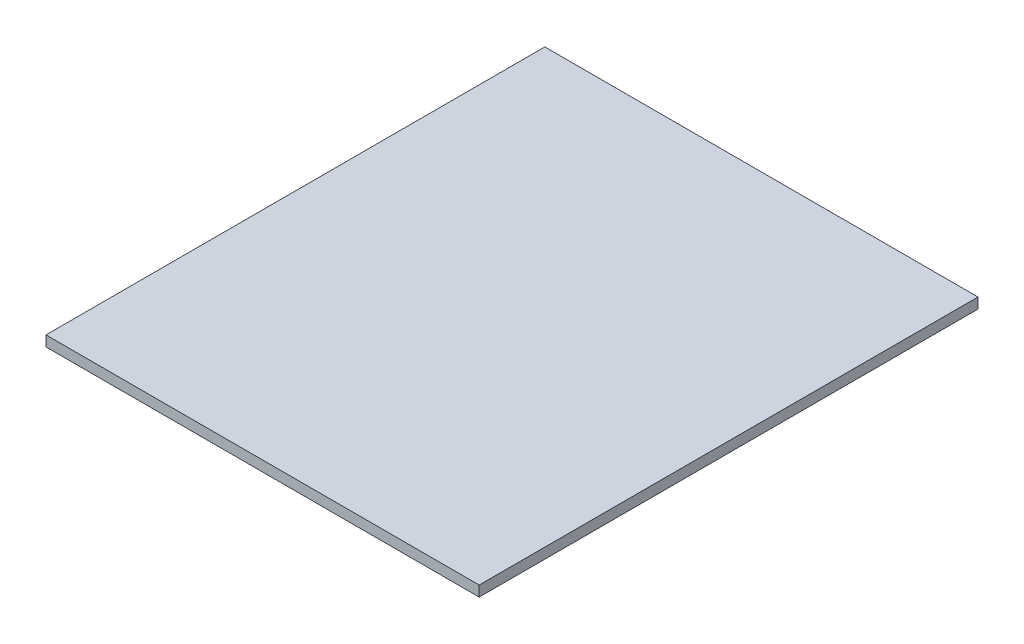
ISO-10303-21;
HEADER;
FILE_DESCRIPTION(('STEP AP214'),'2;1');
FILE_NAME('part.step','',(''),(''),'','','');
FILE_SCHEMA(('AUTOMOTIVE_DESIGN { 1 0 10303 214 1 1 1 1 }'));
ENDSEC;
DATA;
#1=APPLICATION_CONTEXT('core data for automotive mechanical design processes');
#2=APPLICATION_PROTOCOL_DEFINITION('international standard','automotive_design',2000,#1);
#3=PRODUCT_CONTEXT('',#1,'mechanical');
#4=PRODUCT('Part','Part','',(#3));
#5=PRODUCT_RELATED_PRODUCT_CATEGORY('part','',(#4));
#6=PRODUCT_DEFINITION_FORMATION('','',#4);
#7=PRODUCT_DEFINITION_CONTEXT('part definition',#1,'design');
#8=PRODUCT_DEFINITION('design','',#6,#7);
#9=PRODUCT_DEFINITION_SHAPE('','',#8);
#10=(LENGTH_UNIT() NAMED_UNIT(*) SI_UNIT(.MILLI.,.METRE.));
#11=(NAMED_UNIT(*) PLANE_ANGLE_UNIT() SI_UNIT($,.RADIAN.));
#12=(NAMED_UNIT(*) SI_UNIT($,.STERADIAN.) SOLID_ANGLE_UNIT());
#13=UNCERTAINTY_MEASURE_WITH_UNIT(LENGTH_MEASURE(1.E-05),#10,'distance_accuracy_value','');
#14=(GEOMETRIC_REPRESENTATION_CONTEXT(3) GLOBAL_UNCERTAINTY_ASSIGNED_CONTEXT((#13)) GLOBAL_UNIT_ASSIGNED_CONTEXT((#10,
#11,#12)) REPRESENTATION_CONTEXT('',''));
#15=CARTESIAN_POINT('',(0.,0.,0.));
#16=DIRECTION('',(0.,0.,1.));
#17=DIRECTION('',(1.,0.,0.));
#18=AXIS2_PLACEMENT_3D('',#15,#16,#17);
#19=CARTESIAN_POINT('',(-859.675895884739,40.48125,965.077977864291));
#20=DIRECTION('',(1.,0.,0.));
#21=DIRECTION('',(0.,0.,-1.));
#22=AXIS2_PLACEMENT_3D('',#19,#20,#21);
#23=PLANE('',#22);
#24=DIRECTION('',(0.,0.,1.));
#25=VECTOR('',#24,1.);
#26=CARTESIAN_POINT('',(-859.675895884739,0.,965.077977864291));
#27=LINE('',#26,#25);
#28=CARTESIAN_POINT('',(-859.675895884739,0.,-965.322022135709));
#29=VERTEX_POINT('',#28);
#30=CARTESIAN_POINT('',(-859.675895884739,0.,965.077977864291));
#31=VERTEX_POINT('',#30);
#32=EDGE_CURVE('E99',#29,#31,#27,.T.);
#33=ORIENTED_EDGE('',*,*,#32,.T.);
#34=DIRECTION('',(0.,-1.,0.));
#35=VECTOR('',#34,1.);
#36=CARTESIAN_POINT('',(-859.675895884739,40.48125,965.077977864291));
#37=LINE('',#36,#35);
#38=CARTESIAN_POINT('',(-859.675895884739,40.48125,965.077977864291));
#39=VERTEX_POINT('',#38);
#40=EDGE_CURVE('E11',#39,#31,#37,.T.);
#41=ORIENTED_EDGE('',*,*,#40,.F.);
#42=DIRECTION('',(0.,0.,1.));
#43=VECTOR('',#42,1.);
#44=CARTESIAN_POINT('',(-859.675895884739,40.48125,965.077977864291));
#45=LINE('',#44,#43);
#46=CARTESIAN_POINT('',(-859.675895884739,40.48125,-965.322022135709));
#47=VERTEX_POINT('',#46);
#48=EDGE_CURVE('E87',#47,#39,#45,.T.);
#49=ORIENTED_EDGE('',*,*,#48,.F.);
#50=DIRECTION('',(0.,-1.,0.));
#51=VECTOR('',#50,1.);
#52=CARTESIAN_POINT('',(-859.675895884739,40.48125,-965.322022135709));
#53=LINE('',#52,#51);
#54=EDGE_CURVE('E95',#47,#29,#53,.T.);
#55=ORIENTED_EDGE('',*,*,#54,.T.);
#56=EDGE_LOOP('',(#33,#41,#49,#55));
#57=FACE_BOUND('',#56,.T.);
#58=ADVANCED_FACE('F36',(#57),#23,.F.);
#59=CARTESIAN_POINT('',(-859.675895884739,40.48125,965.077977864291));
#60=DIRECTION('',(0.,0.,-1.));
#61=DIRECTION('',(-1.,0.,0.));
#62=AXIS2_PLACEMENT_3D('',#59,#60,#61);
#63=PLANE('',#62);
#64=DIRECTION('',(1.,0.,0.));
#65=VECTOR('',#64,1.);
#66=CARTESIAN_POINT('',(-859.675895884739,0.,965.077977864291));
#67=LINE('',#66,#65);
#68=CARTESIAN_POINT('',(816.72410411526,0.,965.077977864291));
#69=VERTEX_POINT('',#68);
#70=EDGE_CURVE('E91',#31,#69,#67,.T.);
#71=ORIENTED_EDGE('',*,*,#70,.T.);
#72=DIRECTION('',(0.,-1.,0.));
#73=VECTOR('',#72,1.);
#74=CARTESIAN_POINT('',(816.72410411526,40.48125,965.077977864291));
#75=LINE('',#74,#73);
#76=CARTESIAN_POINT('',(816.72410411526,40.48125,965.077977864291));
#77=VERTEX_POINT('',#76);
#78=EDGE_CURVE('E44',#77,#69,#75,.T.);
#79=ORIENTED_EDGE('',*,*,#78,.F.);
#80=DIRECTION('',(1.,0.,0.));
#81=VECTOR('',#80,1.);
#82=CARTESIAN_POINT('',(-859.675895884739,40.48125,965.077977864291));
#83=LINE('',#82,#81);
#84=EDGE_CURVE('E82',#39,#77,#83,.T.);
#85=ORIENTED_EDGE('',*,*,#84,.F.);
#86=ORIENTED_EDGE('',*,*,#40,.T.);
#87=EDGE_LOOP('',(#71,#79,#85,#86));
#88=FACE_BOUND('',#87,.T.);
#89=ADVANCED_FACE('F90',(#88),#63,.F.);
#90=CARTESIAN_POINT('',(816.72410411526,40.48125,965.077977864291));
#91=DIRECTION('',(-1.,0.,0.));
#92=DIRECTION('',(0.,0.,1.));
#93=AXIS2_PLACEMENT_3D('',#90,#91,#92);
#94=PLANE('',#93);
#95=DIRECTION('',(0.,0.,-1.));
#96=VECTOR('',#95,1.);
#97=CARTESIAN_POINT('',(816.72410411526,0.,965.077977864291));
#98=LINE('',#97,#96);
#99=CARTESIAN_POINT('',(816.72410411526,0.,-965.322022135709));
#100=VERTEX_POINT('',#99);
#101=EDGE_CURVE('E69',#69,#100,#98,.T.);
#102=ORIENTED_EDGE('',*,*,#101,.T.);
#103=DIRECTION('',(0.,-1.,0.));
#104=VECTOR('',#103,1.);
#105=CARTESIAN_POINT('',(816.72410411526,40.48125,-965.322022135709));
#106=LINE('',#105,#104);
#107=CARTESIAN_POINT('',(816.72410411526,40.48125,-965.322022135709));
#108=VERTEX_POINT('',#107);
#109=EDGE_CURVE('E92',#108,#100,#106,.T.);
#110=ORIENTED_EDGE('',*,*,#109,.F.);
#111=DIRECTION('',(0.,0.,-1.));
#112=VECTOR('',#111,1.);
#113=CARTESIAN_POINT('',(816.72410411526,40.48125,965.077977864291));
#114=LINE('',#113,#112);
#115=EDGE_CURVE('E85',#77,#108,#114,.T.);
#116=ORIENTED_EDGE('',*,*,#115,.F.);
#117=ORIENTED_EDGE('',*,*,#78,.T.);
#118=EDGE_LOOP('',(#102,#110,#116,#117));
#119=FACE_BOUND('',#118,.T.);
#120=ADVANCED_FACE('F93',(#119),#94,.F.);
#121=CARTESIAN_POINT('',(-859.675895884739,40.48125,-965.322022135709));
#122=DIRECTION('',(0.,0.,1.));
#123=DIRECTION('',(1.,0.,0.));
#124=AXIS2_PLACEMENT_3D('',#121,#122,#123);
#125=PLANE('',#124);
#126=DIRECTION('',(-1.,0.,0.));
#127=VECTOR('',#126,1.);
#128=CARTESIAN_POINT('',(-859.675895884739,0.,-965.322022135709));
#129=LINE('',#128,#127);
#130=EDGE_CURVE('E75',#100,#29,#129,.T.);
#131=ORIENTED_EDGE('',*,*,#130,.T.);
#132=ORIENTED_EDGE('',*,*,#54,.F.);
#133=DIRECTION('',(-1.,0.,0.));
#134=VECTOR('',#133,1.);
#135=CARTESIAN_POINT('',(-859.675895884739,40.48125,-965.322022135709));
#136=LINE('',#135,#134);
#137=EDGE_CURVE('E52',#108,#47,#136,.T.);
#138=ORIENTED_EDGE('',*,*,#137,.F.);
#139=ORIENTED_EDGE('',*,*,#109,.T.);
#140=EDGE_LOOP('',(#131,#132,#138,#139));
#141=FACE_BOUND('',#140,.T.);
#142=ADVANCED_FACE('F106',(#141),#125,.F.);
#143=CARTESIAN_POINT('',(0.,40.48125,0.));
#144=DIRECTION('',(0.,-1.,0.));
#145=DIRECTION('',(0.,0.,-1.));
#146=AXIS2_PLACEMENT_3D('',#143,#144,#145);
#147=PLANE('',#146);
#148=ORIENTED_EDGE('',*,*,#48,.T.);
#149=ORIENTED_EDGE('',*,*,#84,.T.);
#150=ORIENTED_EDGE('',*,*,#115,.T.);
#151=ORIENTED_EDGE('',*,*,#137,.T.);
#152=EDGE_LOOP('',(#148,#149,#150,#151));
#153=FACE_BOUND('',#152,.T.);
#154=ADVANCED_FACE('F83',(#153),#147,.F.);
#155=CARTESIAN_POINT('',(0.,0.,0.));
#156=DIRECTION('',(0.,-1.,0.));
#157=DIRECTION('',(0.,0.,-1.));
#158=AXIS2_PLACEMENT_3D('',#155,#156,#157);
#159=PLANE('',#158);
#160=ORIENTED_EDGE('',*,*,#32,.F.);
#161=ORIENTED_EDGE('',*,*,#130,.F.);
#162=ORIENTED_EDGE('',*,*,#101,.F.);
#163=ORIENTED_EDGE('',*,*,#70,.F.);
#164=EDGE_LOOP('',(#160,#161,#162,#163));
#165=FACE_BOUND('',#164,.T.);
#166=ADVANCED_FACE('F109',(#165),#159,.T.);
#167=CLOSED_SHELL('',(#58,#89,#120,#142,#154,#166));
#168=MANIFOLD_SOLID_BREP('B2',#167);
#169=ADVANCED_BREP_SHAPE_REPRESENTATION('',(#18,#168),#14);
#170=SHAPE_DEFINITION_REPRESENTATION(#9,#169);
ENDSEC;
END-ISO-10303-21;
